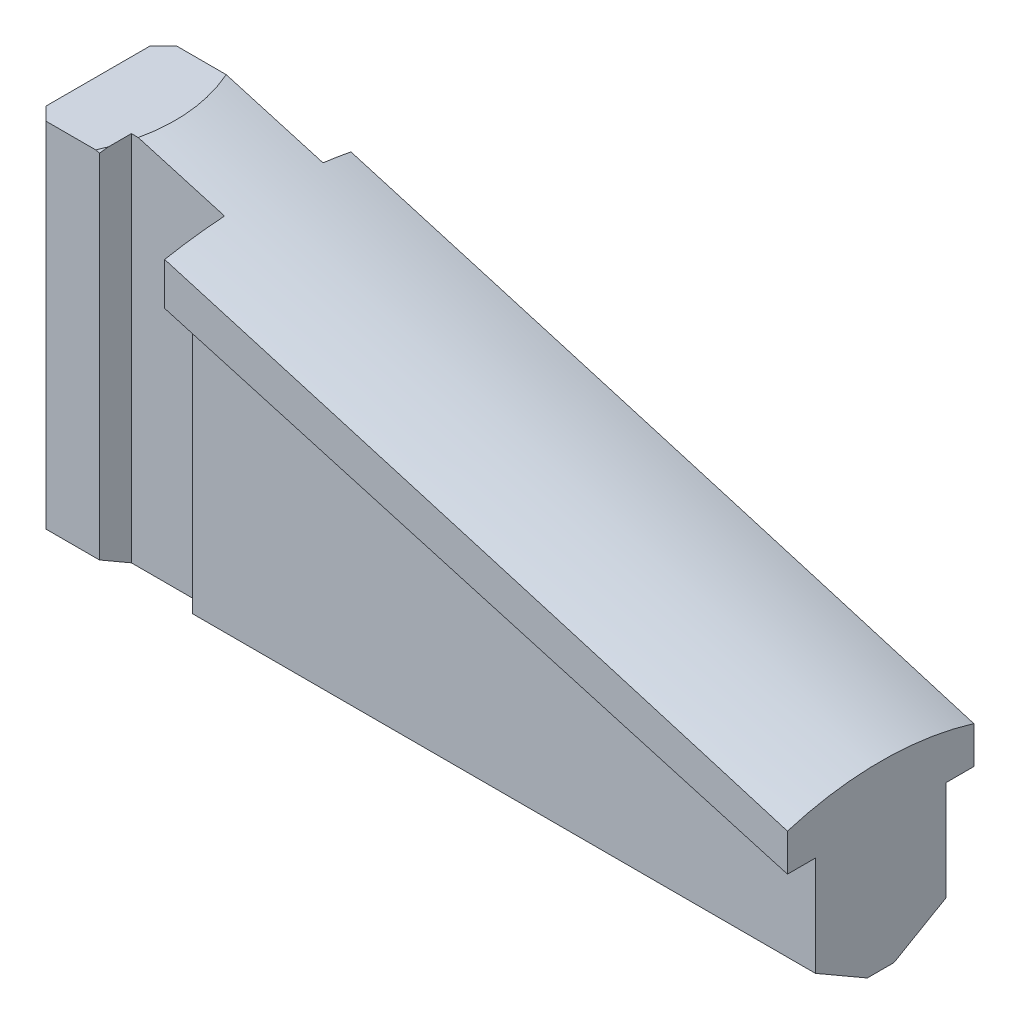
ISO-10303-21;
HEADER;
FILE_DESCRIPTION(('STEP AP214'),'2;1');
FILE_NAME('part.step','',(''),(''),'','','');
FILE_SCHEMA(('AUTOMOTIVE_DESIGN { 1 0 10303 214 1 1 1 1 }'));
ENDSEC;
DATA;
#1=APPLICATION_CONTEXT('core data for automotive mechanical design processes');
#2=APPLICATION_PROTOCOL_DEFINITION('international standard','automotive_design',2000,#1);
#3=PRODUCT_CONTEXT('',#1,'mechanical');
#4=PRODUCT('Part','Part','',(#3));
#5=PRODUCT_RELATED_PRODUCT_CATEGORY('part','',(#4));
#6=PRODUCT_DEFINITION_FORMATION('','',#4);
#7=PRODUCT_DEFINITION_CONTEXT('part definition',#1,'design');
#8=PRODUCT_DEFINITION('design','',#6,#7);
#9=PRODUCT_DEFINITION_SHAPE('','',#8);
#10=(LENGTH_UNIT() NAMED_UNIT(*) SI_UNIT(.MILLI.,.METRE.));
#11=(NAMED_UNIT(*) PLANE_ANGLE_UNIT() SI_UNIT($,.RADIAN.));
#12=(NAMED_UNIT(*) SI_UNIT($,.STERADIAN.) SOLID_ANGLE_UNIT());
#13=UNCERTAINTY_MEASURE_WITH_UNIT(LENGTH_MEASURE(1.E-05),#10,'distance_accuracy_value','');
#14=(GEOMETRIC_REPRESENTATION_CONTEXT(3) GLOBAL_UNCERTAINTY_ASSIGNED_CONTEXT((#13)) GLOBAL_UNIT_ASSIGNED_CONTEXT((#10,
#11,#12)) REPRESENTATION_CONTEXT('',''));
#15=CARTESIAN_POINT('',(0.,0.,0.));
#16=DIRECTION('',(0.,0.,1.));
#17=DIRECTION('',(1.,0.,0.));
#18=AXIS2_PLACEMENT_3D('',#15,#16,#17);
#19=CARTESIAN_POINT('',(29.4,0.,0.));
#20=DIRECTION('',(-1.,0.,0.));
#21=DIRECTION('',(0.,-1.,0.));
#22=AXIS2_PLACEMENT_3D('',#19,#20,#21);
#23=CONICAL_SURFACE('',#22,12.,0.279252680319085);
#24=CARTESIAN_POINT('',(16.648974308552,15.4634136010911,2.45));
#25=CARTESIAN_POINT('',(14.2499015648652,16.1598687928455,2.45));
#26=CARTESIAN_POINT('',(11.8505479962194,16.8553553952881,2.45));
#27=CARTESIAN_POINT('',(7.05141396770957,18.2448524503624,2.45));
#28=CARTESIAN_POINT('',(4.65163350793611,18.9388629033066,2.45));
#29=CARTESIAN_POINT('',(-0.148220273695114,20.3258688999498,2.45));
#30=CARTESIAN_POINT('',(-2.54829359551783,21.01886444377,2.45));
#31=CARTESIAN_POINT('',(-7.34866481559835,22.404079198679,2.45));
#32=CARTESIAN_POINT('',(-9.74896271390276,23.0962984096063,2.45));
#33=CARTESIAN_POINT('',(-12.1493381150406,23.7882485567215,2.45));
#34=B_SPLINE_CURVE_WITH_KNOTS('',3,(#24,#25,#26,#27,#28,#29,#30,#31,#32,#33),.UNSPECIFIED.,.F.,
.F.,(4,2,2,2,4),(0.,7.49435710344259,14.9887126194894,22.4830672397679,29.9774234187303),.UNSPECIFIED.);
#35=CARTESIAN_POINT('',(2.5,19.5606146497602,2.45));
#36=VERTEX_POINT('',#35);
#37=CARTESIAN_POINT('',(2.36370972869778,19.6,2.45));
#38=VERTEX_POINT('',#37);
#39=EDGE_CURVE('E210',#36,#38,#34,.T.);
#40=ORIENTED_EDGE('',*,*,#39,.F.);
#41=CARTESIAN_POINT('',(2.5,0.,0.));
#42=DIRECTION('',(-1.,0.,0.));
#43=DIRECTION('',(0.,0.,1.));
#44=AXIS2_PLACEMENT_3D('',#41,#42,#43);
#45=CIRCLE('',#44,19.7134508769117);
#46=CARTESIAN_POINT('',(2.5,19.6,2.11190565045207));
#47=VERTEX_POINT('',#46);
#48=EDGE_CURVE('E216',#47,#36,#45,.F.);
#49=ORIENTED_EDGE('',*,*,#48,.F.);
#50=CARTESIAN_POINT('',(-32.9761026612706,19.6,-22.5613953379317));
#51=CARTESIAN_POINT('',(-32.4037117276343,19.6,-22.3439756519684));
#52=CARTESIAN_POINT('',(-31.8317673076096,19.6,-22.1253815060157));
#53=CARTESIAN_POINT('',(-30.6888624996613,19.6,-21.6856253566966));
#54=CARTESIAN_POINT('',(-30.1179021180518,19.6,-21.4644633369235));
#55=CARTESIAN_POINT('',(-28.4065227980442,19.6,-20.7967537598207));
#56=CARTESIAN_POINT('',(-27.267727858128,19.6,-20.3460289834775));
#57=CARTESIAN_POINT('',(-24.9925625901961,19.6,-19.4300769273884));
#58=CARTESIAN_POINT('',(-23.856206099606,19.6,-18.9648152289642));
#59=CARTESIAN_POINT('',(-21.5903228813989,19.6,-18.0180243647236));
#60=CARTESIAN_POINT('',(-20.4607958457072,19.6,-17.536495939247));
#61=CARTESIAN_POINT('',(-18.5845528789361,19.6,-16.7166154177673));
#62=CARTESIAN_POINT('',(-17.8353865180602,19.6,-16.3838729753218));
#63=CARTESIAN_POINT('',(-16.3418196340869,19.6,-15.7077944962536));
#64=CARTESIAN_POINT('',(-15.5974192014677,19.6,-15.3644582592298));
#65=CARTESIAN_POINT('',(-14.1154293473856,19.6,-14.6656713370954));
#66=CARTESIAN_POINT('',(-13.3778326934464,19.6,-14.3102360231317));
#67=CARTESIAN_POINT('',(-11.9100760846921,19.6,-13.5843370766536));
#68=CARTESIAN_POINT('',(-11.1799157987687,19.6,-13.2138741169456));
#69=CARTESIAN_POINT('',(-9.96405354427752,19.6,-12.5774341037494));
#70=CARTESIAN_POINT('',(-9.47573549603862,19.6,-12.3164572331979));
#71=CARTESIAN_POINT('',(-8.50446829629357,19.6,-11.784709340877));
#72=CARTESIAN_POINT('',(-8.02151894903578,19.6,-11.5139386777467));
#73=CARTESIAN_POINT('',(-7.06105990283729,19.6,-10.9602326773217));
#74=CARTESIAN_POINT('',(-6.58356627281471,19.6,-10.6772693804072));
#75=CARTESIAN_POINT('',(-5.63699211912866,19.6,-10.0976439551953));
#76=CARTESIAN_POINT('',(-5.16791077276661,19.6,-9.80098317673032));
#77=CARTESIAN_POINT('',(-4.22811194939514,19.6,-9.18292901731352));
#78=CARTESIAN_POINT('',(-3.75768942942859,19.6,-8.86108516833704));
#79=CARTESIAN_POINT('',(-2.83185165618119,19.6,-8.19573914092854));
#80=CARTESIAN_POINT('',(-2.37644427001668,19.6,-7.85222587508762));
#81=CARTESIAN_POINT('',(-1.71022345967279,19.6,-7.31735433038008));
#82=CARTESIAN_POINT('',(-1.49129258024198,19.6,-7.13609414578184));
#83=CARTESIAN_POINT('',(-1.05991693228104,19.6,-6.76603246286251));
#84=CARTESIAN_POINT('',(-0.847471366392736,19.6,-6.57723189826044));
#85=CARTESIAN_POINT('',(-0.430638290164144,19.6,-6.19130300817174));
#86=CARTESIAN_POINT('',(-0.226243110019437,19.6,-5.99418299897473));
#87=CARTESIAN_POINT('',(0.172843030773745,19.6,-5.59039922037483));
#88=CARTESIAN_POINT('',(0.367536502151622,19.6,-5.38373794713165));
#89=CARTESIAN_POINT('',(0.707016040224538,19.6,-5.00218617018962));
#90=CARTESIAN_POINT('',(0.853977495164868,19.6,-4.82924129687953));
#91=CARTESIAN_POINT('',(1.13859146051837,19.6,-4.47587421580012));
#92=CARTESIAN_POINT('',(1.27624331967451,19.6,-4.29545148633497));
#93=CARTESIAN_POINT('',(1.67235329508835,19.6,-3.74218576449378));
#94=CARTESIAN_POINT('',(1.91428985179766,19.6,-3.35699211824213));
#95=CARTESIAN_POINT('',(2.29055811810728,19.6,-2.63287276558472));
#96=CARTESIAN_POINT('',(2.4367492115385,19.6,-2.30026569364202));
#97=CARTESIAN_POINT('',(2.61455883885051,19.6,-1.78746631092453));
#98=CARTESIAN_POINT('',(2.66688645021653,19.6,-1.6143856715285));
#99=CARTESIAN_POINT('',(2.75627609376926,19.6,-1.26436269774037));
#100=CARTESIAN_POINT('',(2.79334642470975,19.6,-1.08742251793142));
#101=CARTESIAN_POINT('',(2.84642972070667,19.6,-0.758941432175118));
#102=CARTESIAN_POINT('',(2.86483843375335,19.6,-0.607785450560269));
#103=CARTESIAN_POINT('',(2.88945206715889,19.6,-0.304424716506118));
#104=CARTESIAN_POINT('',(2.89565275919185,19.6,-0.152219619008924));
#105=CARTESIAN_POINT('',(2.89564715268429,19.6,0.184783225109387));
#106=CARTESIAN_POINT('',(2.88650291841559,19.6,0.369587849325975));
#107=CARTESIAN_POINT('',(2.85028896690921,19.6,0.737499610884878));
#108=CARTESIAN_POINT('',(2.82320966241454,19.6,0.920605787203419));
#109=CARTESIAN_POINT('',(2.75210849424193,19.6,1.28377592085298));
#110=CARTESIAN_POINT('',(2.70806031542061,19.6,1.46383469729142));
#111=CARTESIAN_POINT('',(2.60454257817562,19.6,1.81951176633121));
#112=CARTESIAN_POINT('',(2.54506249614258,19.6,1.99512693862231));
#113=CARTESIAN_POINT('',(2.30427165763243,19.6,2.62302316125304));
#114=CARTESIAN_POINT('',(2.08230946019525,19.6,3.06008853193767));
#115=CARTESIAN_POINT('',(1.70164415269635,19.6,3.68522964861305));
#116=CARTESIAN_POINT('',(1.56652788542073,19.6,3.88885824713228));
#117=CARTESIAN_POINT('',(1.2831364085347,19.6,4.28683377149784));
#118=CARTESIAN_POINT('',(1.13486264315188,19.6,4.48118171243876));
#119=CARTESIAN_POINT('',(0.790944913344987,19.6,4.90658096243323));
#120=CARTESIAN_POINT('',(0.592448334942414,19.6,5.13530465877458));
#121=CARTESIAN_POINT('',(0.182580718973677,19.6,5.58098944974586));
#122=CARTESIAN_POINT('',(-0.0287953526772932,19.6,5.79794588157711));
#123=CARTESIAN_POINT('',(-0.46203197667514,19.6,6.22172285893849));
#124=CARTESIAN_POINT('',(-0.683907576483541,19.6,6.42852793531985));
#125=CARTESIAN_POINT('',(-1.13588736347237,19.6,6.83295301781529));
#126=CARTESIAN_POINT('',(-1.3659924999303,19.6,7.03057195822244));
#127=CARTESIAN_POINT('',(-1.83581930597113,19.6,7.42012260034748));
#128=CARTESIAN_POINT('',(-2.07562523110806,19.6,7.61195232587221));
#129=CARTESIAN_POINT('',(-2.56091145127948,19.6,7.98828556745229));
#130=CARTESIAN_POINT('',(-2.80639190459472,19.6,8.17278887875942));
#131=CARTESIAN_POINT('',(-3.30182787792126,19.6,8.53510859401967));
#132=CARTESIAN_POINT('',(-3.55177836369394,19.6,8.71293189749269));
#133=CARTESIAN_POINT('',(-4.05567203684115,19.6,9.06279157826125));
#134=CARTESIAN_POINT('',(-4.30961508321022,19.6,9.23482815925611));
#135=CARTESIAN_POINT('',(-5.14242746108447,19.6,9.78688974963045));
#136=CARTESIAN_POINT('',(-5.72828854185113,19.6,10.1563880903412));
#137=CARTESIAN_POINT('',(-6.91261283662009,19.6,10.8746903397837));
#138=CARTESIAN_POINT('',(-7.51107882718987,19.6,11.2234896230133));
#139=CARTESIAN_POINT('',(-8.71794252239,19.6,11.9045180372574));
#140=CARTESIAN_POINT('',(-9.32634751575072,19.6,12.2367342097782));
#141=CARTESIAN_POINT('',(-10.5504707571136,19.6,12.8872301303857));
#142=CARTESIAN_POINT('',(-11.1661884181356,19.6,13.2055109875619));
#143=CARTESIAN_POINT('',(-12.4059357524608,19.6,13.8316463832656));
#144=CARTESIAN_POINT('',(-13.0299886266361,19.6,14.1394548649588));
#145=CARTESIAN_POINT('',(-14.2829174063942,19.6,14.7450991131054));
#146=CARTESIAN_POINT('',(-14.9117933963925,19.6,15.0429347045189));
#147=CARTESIAN_POINT('',(-16.1732535188856,19.6,15.6299077762231));
#148=CARTESIAN_POINT('',(-16.8058359269823,19.6,15.9190489686718));
#149=CARTESIAN_POINT('',(-18.0743496524969,19.6,16.4898967347759));
#150=CARTESIAN_POINT('',(-18.7102810117578,19.6,16.7716032152736));
#151=CARTESIAN_POINT('',(-20.4747796546366,19.6,17.5425217465608));
#152=CARTESIAN_POINT('',(-21.6063647535255,19.6,18.0248296707626));
#153=CARTESIAN_POINT('',(-23.8764625219945,19.6,18.9731755821111));
#154=CARTESIAN_POINT('',(-25.0149760106162,19.6,19.4392116000033));
#155=CARTESIAN_POINT('',(-27.2882890293088,19.6,20.3541938129891));
#156=CARTESIAN_POINT('',(-28.4230456604573,19.6,20.8032467310804));
#157=CARTESIAN_POINT('',(-30.1282995205691,19.6,21.4684964330804));
#158=CARTESIAN_POINT('',(-30.6971853889986,19.6,21.6888383848163));
#159=CARTESIAN_POINT('',(-31.8359339637115,19.6,22.1269739814008));
#160=CARTESIAN_POINT('',(-32.4057966642743,19.6,22.3447676411151));
#161=CARTESIAN_POINT('',(-32.9761026612707,19.6,22.5613953379317));
#162=B_SPLINE_CURVE_WITH_KNOTS('',3,(#50,#51,#52,#53,#54,#55,#56,#57,#58,#59,#60,#61,#62,#63,
#64,#65,#66,#67,#68,#69,#70,#71,#72,#73,#74,#75,#76,#77,#78,#79,#80,#81,#82,#83,#84,#85,#86,#87,
#88,#89,#90,#91,#92,#93,#94,#95,#96,#97,#98,#99,#100,#101,#102,#103,#104,#105,#106,#107,#108,
#109,#110,#111,#112,#113,#114,#115,#116,#117,#118,#119,#120,#121,#122,#123,#124,#125,#126,#127,
#128,#129,#130,#131,#132,#133,#134,#135,#136,#137,#138,#139,#140,#141,#142,#143,#144,#145,#146,
#147,#148,#149,#150,#151,#152,#153,#154,#155,#156,#157,#158,#159,#160,#161),.UNSPECIFIED.,.F.,
.F.,(4,2,2,2,2,2,2,2,2,2,2,2,2,2,2,2,2,2,2,2,2,2,2,2,2,2,2,2,2,2,2,2,2,2,2,2,2,2,2,2,2,2,2,2,2,
2,2,2,2,2,2,2,2,2,2,4),(0.,1.83687632474504,3.67376439219321,7.34793246840589,11.0315806296531,
14.7150613640671,17.1742050369041,19.6333952575021,22.0895699845274,24.5456348666396,
26.2065892486815,27.8674828696458,29.5324122072418,31.1971778214068,32.9066929583208,
34.6170899969298,35.4696388170458,36.3220823920952,37.1736931443152,38.0250823491319,
38.7056375622454,39.3862403347703,40.7460157080446,41.8317726896373,42.373644924596,
42.915222033163,43.3715706437659,43.8280772858324,44.3822421835907,44.9367035515556,
45.4920282561841,46.0477326580858,47.5084627821284,48.2413574120247,48.9741716953041,
49.8821073204126,50.7904001268682,51.7000366012292,52.6097783427863,53.5308925195205,
54.4520324201541,55.3721931753557,56.2923215058664,58.3696324043435,60.4474057732402,
62.5267781377556,64.6059847063747,66.6933891795409,68.78083027074,70.8673670753062,
72.9539300119745,76.6440026214591,80.3345202729014,83.9955785794344,85.8257747098621,
87.6559601584339),.UNSPECIFIED.);
#163=EDGE_CURVE('E194',#47,#38,#162,.T.);
#164=ORIENTED_EDGE('',*,*,#163,.T.);
#165=EDGE_LOOP('',(#40,#49,#164));
#166=FACE_BOUND('',#165,.T.);
#167=ADVANCED_FACE('F37',(#166),#23,.T.);
#168=CARTESIAN_POINT('',(-28.8555086557732,26.7827385853238,2.45));
#169=DIRECTION('',(0.,0.,-1.));
#170=DIRECTION('',(-1.,0.,0.));
#171=AXIS2_PLACEMENT_3D('',#168,#169,#170);
#172=PLANE('',#171);
#173=DIRECTION('',(-1.,0.,0.));
#174=VECTOR('',#173,1.);
#175=CARTESIAN_POINT('',(0.,19.6,2.45));
#176=LINE('',#175,#174);
#177=CARTESIAN_POINT('',(0.499999999999997,19.6,2.45));
#178=VERTEX_POINT('',#177);
#179=EDGE_CURVE('E195',#38,#178,#176,.T.);
#180=ORIENTED_EDGE('',*,*,#179,.T.);
#181=DIRECTION('',(0.,-1.,0.));
#182=VECTOR('',#181,1.);
#183=CARTESIAN_POINT('',(0.499999999999998,6.32583302491978,2.45));
#184=LINE('',#183,#182);
#185=CARTESIAN_POINT('',(0.499999999999998,6.32583302491978,2.45));
#186=VERTEX_POINT('',#185);
#187=EDGE_CURVE('E45',#178,#186,#184,.T.);
#188=ORIENTED_EDGE('',*,*,#187,.T.);
#189=DIRECTION('',(1.,0.,0.));
#190=VECTOR('',#189,1.);
#191=CARTESIAN_POINT('',(0.,6.32583302491978,2.45));
#192=LINE('',#191,#190);
#193=CARTESIAN_POINT('',(2.5,6.32583302491978,2.45));
#194=VERTEX_POINT('',#193);
#195=EDGE_CURVE('E381',#186,#194,#192,.T.);
#196=ORIENTED_EDGE('',*,*,#195,.T.);
#197=DIRECTION('',(0.,1.,0.));
#198=VECTOR('',#197,1.);
#199=CARTESIAN_POINT('',(2.5,5.2,2.45));
#200=LINE('',#199,#198);
#201=EDGE_CURVE('E187',#194,#36,#200,.T.);
#202=ORIENTED_EDGE('',*,*,#201,.T.);
#203=ORIENTED_EDGE('',*,*,#39,.T.);
#204=EDGE_LOOP('',(#180,#188,#196,#202,#203));
#205=FACE_BOUND('',#204,.T.);
#206=ADVANCED_FACE('F423',(#205),#172,.F.);
#207=CARTESIAN_POINT('',(0.,0.,-20.4303143413087));
#208=DIRECTION('',(-1.,0.,0.));
#209=DIRECTION('',(0.,-1.,0.));
#210=AXIS2_PLACEMENT_3D('',#207,#208,#209);
#211=PLANE('',#210);
#212=DIRECTION('',(0.,0.,1.));
#213=VECTOR('',#212,1.);
#214=CARTESIAN_POINT('',(0.,19.6,3.5));
#215=LINE('',#214,#213);
#216=CARTESIAN_POINT('',(0.,19.6,-1.95));
#217=VERTEX_POINT('',#216);
#218=CARTESIAN_POINT('',(0.,19.6,1.95));
#219=VERTEX_POINT('',#218);
#220=EDGE_CURVE('E256',#217,#219,#215,.T.);
#221=ORIENTED_EDGE('',*,*,#220,.F.);
#222=DIRECTION('',(0.,-1.,0.));
#223=VECTOR('',#222,1.);
#224=CARTESIAN_POINT('',(0.,6.32583302491978,-1.95));
#225=LINE('',#224,#223);
#226=CARTESIAN_POINT('',(0.,6.03715789032496,-1.95));
#227=VERTEX_POINT('',#226);
#228=EDGE_CURVE('E245',#217,#227,#225,.T.);
#229=ORIENTED_EDGE('',*,*,#228,.T.);
#230=DIRECTION('',(0.,0.500000000000001,-0.866025403784438));
#231=VECTOR('',#230,1.);
#232=CARTESIAN_POINT('',(0.,5.2,-0.500000000000001));
#233=LINE('',#232,#231);
#234=CARTESIAN_POINT('',(0.,5.2,-0.500000000000001));
#235=VERTEX_POINT('',#234);
#236=EDGE_CURVE('E268',#235,#227,#233,.T.);
#237=ORIENTED_EDGE('',*,*,#236,.F.);
#238=DIRECTION('',(0.,0.,-1.));
#239=VECTOR('',#238,1.);
#240=CARTESIAN_POINT('',(0.,5.2,0.499999999999999));
#241=LINE('',#240,#239);
#242=CARTESIAN_POINT('',(0.,5.2,0.499999999999999));
#243=VERTEX_POINT('',#242);
#244=EDGE_CURVE('E301',#243,#235,#241,.T.);
#245=ORIENTED_EDGE('',*,*,#244,.F.);
#246=DIRECTION('',(0.,-0.500000000000001,-0.866025403784438));
#247=VECTOR('',#246,1.);
#248=CARTESIAN_POINT('',(0.,6.93205080756888,3.5));
#249=LINE('',#248,#247);
#250=CARTESIAN_POINT('',(0.,6.03715789032496,1.95));
#251=VERTEX_POINT('',#250);
#252=EDGE_CURVE('E299',#251,#243,#249,.T.);
#253=ORIENTED_EDGE('',*,*,#252,.F.);
#254=DIRECTION('',(0.,1.,0.));
#255=VECTOR('',#254,1.);
#256=CARTESIAN_POINT('',(0.,19.6,1.95));
#257=LINE('',#256,#255);
#258=EDGE_CURVE('E240',#251,#219,#257,.T.);
#259=ORIENTED_EDGE('',*,*,#258,.T.);
#260=EDGE_LOOP('',(#221,#229,#237,#245,#253,#259));
#261=FACE_BOUND('',#260,.T.);
#262=ADVANCED_FACE('F262',(#261),#211,.T.);
#263=CARTESIAN_POINT('',(0.,19.6,3.5));
#264=DIRECTION('',(0.,0.,1.));
#265=DIRECTION('',(0.,-1.,0.));
#266=AXIS2_PLACEMENT_3D('',#263,#264,#265);
#267=PLANE('',#266);
#268=DIRECTION('',(0.,1.,0.));
#269=VECTOR('',#268,1.);
#270=CARTESIAN_POINT('',(6.,5.2,3.5));
#271=LINE('',#270,#269);
#272=CARTESIAN_POINT('',(6.,16.7880823100049,3.5));
#273=VERTEX_POINT('',#272);
#274=CARTESIAN_POINT('',(6.,18.3795589899802,3.5));
#275=VERTEX_POINT('',#274);
#276=EDGE_CURVE('E197',#273,#275,#271,.T.);
#277=ORIENTED_EDGE('',*,*,#276,.F.);
#278=DIRECTION('',(0.961261695938321,-0.275637355816993,0.));
#279=VECTOR('',#278,1.);
#280=CARTESIAN_POINT('',(-28.8555086557732,26.7827385853238,3.5));
#281=LINE('',#280,#279);
#282=CARTESIAN_POINT('',(29.4,10.078240283249,3.5));
#283=VERTEX_POINT('',#282);
#284=EDGE_CURVE('E366',#273,#283,#281,.T.);
#285=ORIENTED_EDGE('',*,*,#284,.T.);
#286=DIRECTION('',(0.,-1.,0.));
#287=VECTOR('',#286,1.);
#288=CARTESIAN_POINT('',(29.4,19.6,3.5));
#289=LINE('',#288,#287);
#290=CARTESIAN_POINT('',(29.4,11.478240283249,3.5));
#291=VERTEX_POINT('',#290);
#292=EDGE_CURVE('E281',#291,#283,#289,.T.);
#293=ORIENTED_EDGE('',*,*,#292,.F.);
#294=CARTESIAN_POINT('',(-24.4862239665545,27.2275921511048,3.5));
#295=CARTESIAN_POINT('',(-22.0798199408507,26.5318728919526,3.5));
#296=CARTESIAN_POINT('',(-19.6735231528163,25.8357822455356,3.5));
#297=CARTESIAN_POINT('',(-14.8612253958074,24.4425777870014,3.5));
#298=CARTESIAN_POINT('',(-12.4552244268803,23.7454639747201,3.5));
#299=CARTESIAN_POINT('',(-7.643401781421,22.3498754033885,3.5));
#300=CARTESIAN_POINT('',(-5.23758013609523,21.6514005367203,3.5));
#301=CARTESIAN_POINT('',(-0.426441208162646,20.2527148818305,3.5));
#302=CARTESIAN_POINT('',(1.97887607441682,19.5525040935148,3.5));
#303=CARTESIAN_POINT('',(6.78880785262404,18.1497081197026,3.5));
#304=CARTESIAN_POINT('',(9.19342235103349,17.4471229437465,3.5));
#305=CARTESIAN_POINT('',(14.0016667244368,16.0385888610674,3.5));
#306=CARTESIAN_POINT('',(16.4052965995313,15.3326399546887,3.5));
#307=CARTESIAN_POINT('',(20.0095530676765,14.2699397550698,3.5));
#308=CARTESIAN_POINT('',(21.2107393959649,13.9150871143786,3.5));
#309=CARTESIAN_POINT('',(23.6126381065094,13.2037818208288,3.5));
#310=CARTESIAN_POINT('',(24.8133504888813,12.8473291683611,3.5));
#311=CARTESIAN_POINT('',(27.2141727876265,12.1323854452225,3.5));
#312=CARTESIAN_POINT('',(28.4142827020149,11.773894367883,3.5));
#313=CARTESIAN_POINT('',(30.8137050134346,11.0542534530831,3.5));
#314=CARTESIAN_POINT('',(32.0130174109581,10.6931036172653,3.5));
#315=CARTESIAN_POINT('',(34.4106417489478,9.96720747548132,3.5));
#316=CARTESIAN_POINT('',(35.6089536170361,9.60246093028408,3.5));
#317=CARTESIAN_POINT('',(38.0040498344003,8.8680255437063,3.5));
#318=CARTESIAN_POINT('',(39.2008342022994,8.49833676322404,3.5));
#319=CARTESIAN_POINT('',(40.9943554707307,7.93835433823676,3.5));
#320=CARTESIAN_POINT('',(41.591940726117,7.75077871562689,3.5));
#321=CARTESIAN_POINT('',(42.786396076621,7.37337046382224,3.5));
#322=CARTESIAN_POINT('',(43.3832661745867,7.18353784364913,3.5));
#323=CARTESIAN_POINT('',(44.5761235718612,6.80103571845603,3.5));
#324=CARTESIAN_POINT('',(45.1721108365771,6.60836610534729,3.5));
#325=CARTESIAN_POINT('',(46.06520273882,6.31662652843912,3.5));
#326=CARTESIAN_POINT('',(46.3627539074134,6.21892346513811,3.5));
#327=CARTESIAN_POINT('',(46.9575092499282,6.02246387545338,3.5));
#328=CARTESIAN_POINT('',(47.2547134227113,5.92370734562506,3.5));
#329=CARTESIAN_POINT('',(47.5517184759023,5.82435331999529,3.5));
#330=B_SPLINE_CURVE_WITH_KNOTS('',3,(#294,#295,#296,#297,#298,#299,#300,#301,#302,#303,#304,
#305,#306,#307,#308,#309,#310,#311,#312,#313,#314,#315,#316,#317,#318,#319,#320,#321,#322,#323,
#324,#325,#326,#327,#328,#329),.UNSPECIFIED.,.F.,.F.,(4,2,2,2,2,2,2,2,2,2,2,2,2,2,2,2,2,4),(0.,
7.51486880153095,15.0297388086319,22.5452293017897,30.0607202023464,37.5761809413504,
45.0916409115,48.8491553465311,52.6066688636819,56.3641946802612,60.1217181757054,
63.8794933075354,67.6372221786194,69.5162170565786,71.3952044263431,73.2742635712691,
74.2138060058775,75.1533515135305),.UNSPECIFIED.);
#331=EDGE_CURVE('E343',#275,#291,#330,.T.);
#332=ORIENTED_EDGE('',*,*,#331,.F.);
#333=EDGE_LOOP('',(#277,#285,#293,#332));
#334=FACE_BOUND('',#333,.T.);
#335=ADVANCED_FACE('F339',(#334),#267,.T.);
#336=CARTESIAN_POINT('',(0.,19.6,3.5));
#337=DIRECTION('',(0.,1.,0.));
#338=DIRECTION('',(-1.,0.,0.));
#339=AXIS2_PLACEMENT_3D('',#336,#337,#338);
#340=PLANE('',#339);
#341=DIRECTION('',(1.,0.,0.));
#342=VECTOR('',#341,1.);
#343=CARTESIAN_POINT('',(0.,19.6,-2.45));
#344=LINE('',#343,#342);
#345=CARTESIAN_POINT('',(0.499999999999998,19.6,-2.45));
#346=VERTEX_POINT('',#345);
#347=CARTESIAN_POINT('',(2.36370972869777,19.6,-2.45));
#348=VERTEX_POINT('',#347);
#349=EDGE_CURVE('E257',#346,#348,#344,.T.);
#350=ORIENTED_EDGE('',*,*,#349,.F.);
#351=DIRECTION('',(-0.70710678118655,0.,0.707106781186545));
#352=VECTOR('',#351,1.);
#353=CARTESIAN_POINT('',(-2.72500000000001,19.6,0.77499999999998));
#354=LINE('',#353,#352);
#355=EDGE_CURVE('E253',#346,#217,#354,.T.);
#356=ORIENTED_EDGE('',*,*,#355,.T.);
#357=ORIENTED_EDGE('',*,*,#220,.T.);
#358=DIRECTION('',(0.70710678118655,0.,0.707106781186545));
#359=VECTOR('',#358,1.);
#360=CARTESIAN_POINT('',(0.774999999999995,19.6,2.725));
#361=LINE('',#360,#359);
#362=EDGE_CURVE('E59',#219,#178,#361,.T.);
#363=ORIENTED_EDGE('',*,*,#362,.T.);
#364=ORIENTED_EDGE('',*,*,#179,.F.);
#365=ORIENTED_EDGE('',*,*,#163,.F.);
#366=DIRECTION('',(0.,0.,1.));
#367=VECTOR('',#366,1.);
#368=CARTESIAN_POINT('',(2.5,19.6,2.45));
#369=LINE('',#368,#367);
#370=CARTESIAN_POINT('',(2.5,19.6,1.25));
#371=VERTEX_POINT('',#370);
#372=EDGE_CURVE('E178',#371,#47,#369,.T.);
#373=ORIENTED_EDGE('',*,*,#372,.F.);
#374=DIRECTION('',(-1.,0.,0.));
#375=VECTOR('',#374,1.);
#376=CARTESIAN_POINT('',(2.5,19.6,1.25));
#377=LINE('',#376,#375);
#378=CARTESIAN_POINT('',(2.75678401454587,19.6,1.25));
#379=VERTEX_POINT('',#378);
#380=EDGE_CURVE('E167',#379,#371,#377,.T.);
#381=ORIENTED_EDGE('',*,*,#380,.F.);
#382=EDGE_CURVE('E316',#348,#379,#162,.T.);
#383=ORIENTED_EDGE('',*,*,#382,.F.);
#384=EDGE_LOOP('',(#350,#356,#357,#363,#364,#365,#373,#381,#383));
#385=FACE_BOUND('',#384,.T.);
#386=ADVANCED_FACE('F192',(#385),#340,.T.);
#387=CARTESIAN_POINT('',(0.,19.6,-3.5));
#388=DIRECTION('',(0.,0.,-1.));
#389=DIRECTION('',(0.,1.,0.));
#390=AXIS2_PLACEMENT_3D('',#387,#388,#389);
#391=PLANE('',#390);
#392=DIRECTION('',(0.,1.,0.));
#393=VECTOR('',#392,1.);
#394=CARTESIAN_POINT('',(6.,5.2,-3.5));
#395=LINE('',#394,#393);
#396=CARTESIAN_POINT('',(6.,16.7880823100049,-3.5));
#397=VERTEX_POINT('',#396);
#398=CARTESIAN_POINT('',(6.,18.3795589899802,-3.5));
#399=VERTEX_POINT('',#398);
#400=EDGE_CURVE('E393',#397,#399,#395,.T.);
#401=ORIENTED_EDGE('',*,*,#400,.T.);
#402=CARTESIAN_POINT('',(-24.4862239665545,27.2275921511048,-3.5));
#403=CARTESIAN_POINT('',(-22.0798199408507,26.5318728919526,-3.5));
#404=CARTESIAN_POINT('',(-19.6735231528163,25.8357822455356,-3.5));
#405=CARTESIAN_POINT('',(-14.8612253958074,24.4425777870014,-3.5));
#406=CARTESIAN_POINT('',(-12.4552244268803,23.7454639747201,-3.5));
#407=CARTESIAN_POINT('',(-7.643401781421,22.3498754033885,-3.5));
#408=CARTESIAN_POINT('',(-5.23758013609523,21.6514005367203,-3.5));
#409=CARTESIAN_POINT('',(-0.426441208162646,20.2527148818305,-3.5));
#410=CARTESIAN_POINT('',(1.97887607441682,19.5525040935148,-3.5));
#411=CARTESIAN_POINT('',(6.78880785262404,18.1497081197026,-3.5));
#412=CARTESIAN_POINT('',(9.19342235103349,17.4471229437465,-3.5));
#413=CARTESIAN_POINT('',(14.0016667244368,16.0385888610674,-3.5));
#414=CARTESIAN_POINT('',(16.4052965995313,15.3326399546887,-3.5));
#415=CARTESIAN_POINT('',(20.0095530676765,14.2699397550698,-3.5));
#416=CARTESIAN_POINT('',(21.2107393959649,13.9150871143786,-3.5));
#417=CARTESIAN_POINT('',(23.6126381065094,13.2037818208288,-3.5));
#418=CARTESIAN_POINT('',(24.8133504888813,12.8473291683611,-3.5));
#419=CARTESIAN_POINT('',(27.2141727876265,12.1323854452225,-3.5));
#420=CARTESIAN_POINT('',(28.4142827020149,11.773894367883,-3.5));
#421=CARTESIAN_POINT('',(30.8137050134346,11.0542534530831,-3.5));
#422=CARTESIAN_POINT('',(32.0130174109581,10.6931036172653,-3.5));
#423=CARTESIAN_POINT('',(34.4106417489478,9.96720747548132,-3.5));
#424=CARTESIAN_POINT('',(35.6089536170361,9.60246093028408,-3.5));
#425=CARTESIAN_POINT('',(38.0040498344003,8.8680255437063,-3.5));
#426=CARTESIAN_POINT('',(39.2008342022994,8.49833676322404,-3.5));
#427=CARTESIAN_POINT('',(40.9943554707307,7.93835433823676,-3.5));
#428=CARTESIAN_POINT('',(41.5919407261171,7.75077871562689,-3.5));
#429=CARTESIAN_POINT('',(42.786396076621,7.37337046382224,-3.5));
#430=CARTESIAN_POINT('',(43.3832661745867,7.18353784364913,-3.5));
#431=CARTESIAN_POINT('',(44.5761235718612,6.80103571845603,-3.5));
#432=CARTESIAN_POINT('',(45.1721108365771,6.60836610534729,-3.5));
#433=CARTESIAN_POINT('',(46.06520273882,6.31662652843912,-3.5));
#434=CARTESIAN_POINT('',(46.3627539074134,6.21892346513811,-3.5));
#435=CARTESIAN_POINT('',(46.9575092499282,6.02246387545338,-3.5));
#436=CARTESIAN_POINT('',(47.2547134227113,5.92370734562506,-3.5));
#437=CARTESIAN_POINT('',(47.5517184759023,5.82435331999529,-3.5));
#438=B_SPLINE_CURVE_WITH_KNOTS('',3,(#402,#403,#404,#405,#406,#407,#408,#409,#410,#411,#412,
#413,#414,#415,#416,#417,#418,#419,#420,#421,#422,#423,#424,#425,#426,#427,#428,#429,#430,#431,
#432,#433,#434,#435,#436,#437),.UNSPECIFIED.,.F.,.F.,(4,2,2,2,2,2,2,2,2,2,2,2,2,2,2,2,2,4),(0.,
7.51486880153095,15.0297388086319,22.5452293017897,30.0607202023464,37.5761809413504,
45.0916409115,48.8491553465311,52.6066688636819,56.3641946802612,60.1217181757054,
63.8794933075354,67.6372221786194,69.5162170565786,71.3952044263431,73.2742635712691,
74.2138060058775,75.1533515135305),.UNSPECIFIED.);
#439=CARTESIAN_POINT('',(29.4,11.478240283249,-3.5));
#440=VERTEX_POINT('',#439);
#441=EDGE_CURVE('E307',#440,#399,#438,.F.);
#442=ORIENTED_EDGE('',*,*,#441,.F.);
#443=DIRECTION('',(0.,1.,0.));
#444=VECTOR('',#443,1.);
#445=CARTESIAN_POINT('',(29.4,19.6,-3.5));
#446=LINE('',#445,#444);
#447=CARTESIAN_POINT('',(29.4,10.078240283249,-3.5));
#448=VERTEX_POINT('',#447);
#449=EDGE_CURVE('E297',#448,#440,#446,.T.);
#450=ORIENTED_EDGE('',*,*,#449,.F.);
#451=DIRECTION('',(0.961261695938321,-0.275637355816993,0.));
#452=VECTOR('',#451,1.);
#453=CARTESIAN_POINT('',(-28.8555086557732,26.7827385853238,-3.5));
#454=LINE('',#453,#452);
#455=EDGE_CURVE('E287',#397,#448,#454,.T.);
#456=ORIENTED_EDGE('',*,*,#455,.F.);
#457=EDGE_LOOP('',(#401,#442,#450,#456));
#458=FACE_BOUND('',#457,.T.);
#459=ADVANCED_FACE('F322',(#458),#391,.T.);
#460=CARTESIAN_POINT('',(0.,5.2,-0.500000000000001));
#461=DIRECTION('',(0.,-0.866025403784438,-0.500000000000001));
#462=DIRECTION('',(0.,0.500000000000001,-0.866025403784438));
#463=AXIS2_PLACEMENT_3D('',#460,#461,#462);
#464=PLANE('',#463);
#465=ORIENTED_EDGE('',*,*,#236,.T.);
#466=DIRECTION('',(0.654653670707979,0.377964473009227,-0.654653670707975));
#467=VECTOR('',#466,1.);
#468=CARTESIAN_POINT('',(-0.828571428571435,5.55878195299642,-1.12142857142858));
#469=LINE('',#468,#467);
#470=CARTESIAN_POINT('',(0.499999999999998,6.32583302491978,-2.45));
#471=VERTEX_POINT('',#470);
#472=EDGE_CURVE('E248',#227,#471,#469,.T.);
#473=ORIENTED_EDGE('',*,*,#472,.T.);
#474=DIRECTION('',(-1.,0.,0.));
#475=VECTOR('',#474,1.);
#476=CARTESIAN_POINT('',(0.,6.32583302491978,-2.45));
#477=LINE('',#476,#475);
#478=CARTESIAN_POINT('',(29.4,6.32583302491978,-2.45));
#479=VERTEX_POINT('',#478);
#480=EDGE_CURVE('E275',#479,#471,#477,.T.);
#481=ORIENTED_EDGE('',*,*,#480,.F.);
#482=DIRECTION('',(0.,0.500000000000001,-0.866025403784438));
#483=VECTOR('',#482,1.);
#484=CARTESIAN_POINT('',(29.4,5.2,-0.500000000000001));
#485=LINE('',#484,#483);
#486=CARTESIAN_POINT('',(29.4,5.2,-0.500000000000001));
#487=VERTEX_POINT('',#486);
#488=EDGE_CURVE('E295',#487,#479,#485,.T.);
#489=ORIENTED_EDGE('',*,*,#488,.F.);
#490=DIRECTION('',(1.,0.,0.));
#491=VECTOR('',#490,1.);
#492=CARTESIAN_POINT('',(0.,5.2,-0.500000000000001));
#493=LINE('',#492,#491);
#494=EDGE_CURVE('E305',#235,#487,#493,.T.);
#495=ORIENTED_EDGE('',*,*,#494,.F.);
#496=EDGE_LOOP('',(#465,#473,#481,#489,#495));
#497=FACE_BOUND('',#496,.T.);
#498=ADVANCED_FACE('F273',(#497),#464,.T.);
#499=CARTESIAN_POINT('',(0.,5.2,0.499999999999999));
#500=DIRECTION('',(0.,-1.,0.));
#501=DIRECTION('',(1.,0.,0.));
#502=AXIS2_PLACEMENT_3D('',#499,#500,#501);
#503=PLANE('',#502);
#504=DIRECTION('',(0.,0.,-1.));
#505=VECTOR('',#504,1.);
#506=CARTESIAN_POINT('',(29.4,5.2,0.499999999999999));
#507=LINE('',#506,#505);
#508=CARTESIAN_POINT('',(29.4,5.2,0.499999999999999));
#509=VERTEX_POINT('',#508);
#510=EDGE_CURVE('E292',#509,#487,#507,.T.);
#511=ORIENTED_EDGE('',*,*,#510,.F.);
#512=DIRECTION('',(1.,0.,0.));
#513=VECTOR('',#512,1.);
#514=CARTESIAN_POINT('',(0.,5.2,0.499999999999999));
#515=LINE('',#514,#513);
#516=EDGE_CURVE('E267',#243,#509,#515,.T.);
#517=ORIENTED_EDGE('',*,*,#516,.F.);
#518=ORIENTED_EDGE('',*,*,#244,.T.);
#519=ORIENTED_EDGE('',*,*,#494,.T.);
#520=EDGE_LOOP('',(#511,#517,#518,#519));
#521=FACE_BOUND('',#520,.T.);
#522=ADVANCED_FACE('F331',(#521),#503,.T.);
#523=CARTESIAN_POINT('',(0.,6.93205080756888,3.5));
#524=DIRECTION('',(0.,-0.866025403784438,0.500000000000001));
#525=DIRECTION('',(0.,-0.500000000000001,-0.866025403784438));
#526=AXIS2_PLACEMENT_3D('',#523,#524,#525);
#527=PLANE('',#526);
#528=ORIENTED_EDGE('',*,*,#195,.F.);
#529=DIRECTION('',(-0.65465367070798,-0.377964473009227,-0.654653670707975));
#530=VECTOR('',#529,1.);
#531=CARTESIAN_POINT('',(0.885714285714282,6.5485252716072,2.83571428571428));
#532=LINE('',#531,#530);
#533=EDGE_CURVE('E12',#186,#251,#532,.T.);
#534=ORIENTED_EDGE('',*,*,#533,.T.);
#535=ORIENTED_EDGE('',*,*,#252,.T.);
#536=ORIENTED_EDGE('',*,*,#516,.T.);
#537=DIRECTION('',(0.,-0.500000000000001,-0.866025403784438));
#538=VECTOR('',#537,1.);
#539=CARTESIAN_POINT('',(29.4,6.93205080756889,3.5));
#540=LINE('',#539,#538);
#541=CARTESIAN_POINT('',(29.4,6.32583302491978,2.45));
#542=VERTEX_POINT('',#541);
#543=EDGE_CURVE('E285',#542,#509,#540,.T.);
#544=ORIENTED_EDGE('',*,*,#543,.F.);
#545=CARTESIAN_POINT('',(6.,6.32583302491978,2.45));
#546=VERTEX_POINT('',#545);
#547=EDGE_CURVE('E376',#546,#542,#192,.T.);
#548=ORIENTED_EDGE('',*,*,#547,.F.);
#549=DIRECTION('',(0.,0.500000000000001,0.866025403784438));
#550=VECTOR('',#549,1.);
#551=CARTESIAN_POINT('',(6.,6.93205080756888,3.5));
#552=LINE('',#551,#550);
#553=CARTESIAN_POINT('',(6.,5.63301270189222,1.25));
#554=VERTEX_POINT('',#553);
#555=EDGE_CURVE('E206',#554,#546,#552,.T.);
#556=ORIENTED_EDGE('',*,*,#555,.F.);
#557=DIRECTION('',(1.,0.,0.));
#558=VECTOR('',#557,1.);
#559=CARTESIAN_POINT('',(0.,5.63301270189222,1.25));
#560=LINE('',#559,#558);
#561=CARTESIAN_POINT('',(2.5,5.63301270189222,1.25));
#562=VERTEX_POINT('',#561);
#563=EDGE_CURVE('E404',#562,#554,#560,.T.);
#564=ORIENTED_EDGE('',*,*,#563,.F.);
#565=DIRECTION('',(0.,-0.500000000000001,-0.866025403784438));
#566=VECTOR('',#565,1.);
#567=CARTESIAN_POINT('',(2.5,6.93205080756888,3.5));
#568=LINE('',#567,#566);
#569=EDGE_CURVE('E186',#194,#562,#568,.T.);
#570=ORIENTED_EDGE('',*,*,#569,.F.);
#571=EDGE_LOOP('',(#528,#534,#535,#536,#544,#548,#556,#564,#570));
#572=FACE_BOUND('',#571,.T.);
#573=ADVANCED_FACE('F334',(#572),#527,.T.);
#574=CARTESIAN_POINT('',(29.4,0.,-12.));
#575=DIRECTION('',(1.,0.,0.));
#576=DIRECTION('',(0.,1.,0.));
#577=AXIS2_PLACEMENT_3D('',#574,#575,#576);
#578=PLANE('',#577);
#579=DIRECTION('',(0.,1.,0.));
#580=VECTOR('',#579,1.);
#581=CARTESIAN_POINT('',(29.4,0.,2.45));
#582=LINE('',#581,#580);
#583=CARTESIAN_POINT('',(29.4,10.078240283249,2.45));
#584=VERTEX_POINT('',#583);
#585=EDGE_CURVE('E351',#542,#584,#582,.T.);
#586=ORIENTED_EDGE('',*,*,#585,.F.);
#587=ORIENTED_EDGE('',*,*,#543,.T.);
#588=ORIENTED_EDGE('',*,*,#510,.T.);
#589=ORIENTED_EDGE('',*,*,#488,.T.);
#590=DIRECTION('',(0.,-1.,0.));
#591=VECTOR('',#590,1.);
#592=CARTESIAN_POINT('',(29.4,10.078240283249,-2.45));
#593=LINE('',#592,#591);
#594=CARTESIAN_POINT('',(29.4,10.078240283249,-2.45));
#595=VERTEX_POINT('',#594);
#596=EDGE_CURVE('E280',#595,#479,#593,.T.);
#597=ORIENTED_EDGE('',*,*,#596,.F.);
#598=DIRECTION('',(0.,0.,1.));
#599=VECTOR('',#598,1.);
#600=CARTESIAN_POINT('',(29.4,10.078240283249,-3.5));
#601=LINE('',#600,#599);
#602=EDGE_CURVE('E383',#448,#595,#601,.T.);
#603=ORIENTED_EDGE('',*,*,#602,.F.);
#604=ORIENTED_EDGE('',*,*,#449,.T.);
#605=CARTESIAN_POINT('',(29.4,0.,0.));
#606=DIRECTION('',(1.,0.,0.));
#607=DIRECTION('',(0.,1.,0.));
#608=AXIS2_PLACEMENT_3D('',#605,#606,#607);
#609=CIRCLE('',#608,12.);
#610=EDGE_CURVE('E348',#440,#291,#609,.T.);
#611=ORIENTED_EDGE('',*,*,#610,.T.);
#612=ORIENTED_EDGE('',*,*,#292,.T.);
#613=DIRECTION('',(0.,0.,1.));
#614=VECTOR('',#613,1.);
#615=CARTESIAN_POINT('',(29.4,10.078240283249,3.5));
#616=LINE('',#615,#614);
#617=EDGE_CURVE('E374',#584,#283,#616,.T.);
#618=ORIENTED_EDGE('',*,*,#617,.F.);
#619=EDGE_LOOP('',(#586,#587,#588,#589,#597,#603,#604,#611,#612,#618));
#620=FACE_BOUND('',#619,.T.);
#621=ADVANCED_FACE('F39',(#620),#578,.T.);
#622=CARTESIAN_POINT('',(20.6183732363522,14.4641786820629,1.25));
#623=CARTESIAN_POINT('',(17.7817321712238,15.2805742764108,1.25));
#624=CARTESIAN_POINT('',(14.9449718753429,16.096555380733,1.25));
#625=CARTESIAN_POINT('',(9.271277408197,17.7279126515956,1.25));
#626=CARTESIAN_POINT('',(6.43434323693603,18.5432888181501,1.25));
#627=CARTESIAN_POINT('',(0.760365517378261,20.1736602810059,1.25));
#628=CARTESIAN_POINT('',(-2.07667803091687,20.9886555773132,1.25));
#629=CARTESIAN_POINT('',(-7.75084561518896,22.6183661814938,1.25));
#630=CARTESIAN_POINT('',(-10.5879696511677,23.4330814893609,1.25));
#631=CARTESIAN_POINT('',(-13.4251194010924,24.2477072194325,1.25));
#632=B_SPLINE_CURVE_WITH_KNOTS('',3,(#622,#623,#624,#625,#626,#627,#628,#629,#630,#631),
.UNSPECIFIED.,.F.,.F.,(4,2,2,2,4),(0.,8.85535468880603,17.7107091729404,26.5660635217355,
35.4214180688607),.UNSPECIFIED.);
#633=CARTESIAN_POINT('',(6.,18.668039229286,1.25));
#634=VERTEX_POINT('',#633);
#635=EDGE_CURVE('E174',#634,#379,#632,.T.);
#636=ORIENTED_EDGE('',*,*,#635,.F.);
#637=CARTESIAN_POINT('',(6.,0.,0.));
#638=DIRECTION('',(1.,0.,0.));
#639=DIRECTION('',(0.,1.,0.));
#640=AXIS2_PLACEMENT_3D('',#637,#638,#639);
#641=CIRCLE('',#640,18.7098420267559);
#642=EDGE_CURVE('E208',#275,#634,#641,.F.);
#643=ORIENTED_EDGE('',*,*,#642,.F.);
#644=ORIENTED_EDGE('',*,*,#331,.T.);
#645=ORIENTED_EDGE('',*,*,#610,.F.);
#646=ORIENTED_EDGE('',*,*,#441,.T.);
#647=CARTESIAN_POINT('',(6.,0.,0.));
#648=DIRECTION('',(1.,0.,0.));
#649=DIRECTION('',(0.,1.,0.));
#650=AXIS2_PLACEMENT_3D('',#647,#648,#649);
#651=CIRCLE('',#650,18.7098420267559);
#652=CARTESIAN_POINT('',(6.,18.548738196065,-2.45));
#653=VERTEX_POINT('',#652);
#654=EDGE_CURVE('E378',#653,#399,#651,.F.);
#655=ORIENTED_EDGE('',*,*,#654,.F.);
#656=CARTESIAN_POINT('',(-14.8313585028478,24.561245884143,-2.45));
#657=CARTESIAN_POINT('',(-11.8917113345279,23.7140993247531,-2.45));
#658=CARTESIAN_POINT('',(-8.95216227176728,22.866611821312,-2.45));
#659=CARTESIAN_POINT('',(-3.07338868936273,21.1705158463323,-2.45));
#660=CARTESIAN_POINT('',(-0.13416416960698,20.3219073751813,-2.45));
#661=CARTESIAN_POINT('',(5.74383474337555,18.6231295927664,-2.45));
#662=CARTESIAN_POINT('',(8.68260913649237,17.7729602811217,-2.45));
#663=CARTESIAN_POINT('',(13.090250854916,16.4959099082395,-2.45));
#664=CARTESIAN_POINT('',(14.5593783685552,16.0699269762682,-2.45));
#665=CARTESIAN_POINT('',(17.497408593882,15.2171861059655,-2.45));
#666=CARTESIAN_POINT('',(18.9663113055478,14.7904281675589,-2.45));
#667=CARTESIAN_POINT('',(20.4350758022215,14.363194640758,-2.45));
#668=B_SPLINE_CURVE_WITH_KNOTS('',3,(#656,#657,#658,#659,#660,#661,#662,#663,#664,#665,#666,
#667),.UNSPECIFIED.,.F.,.F.,(4,2,2,2,2,4),(0.,9.17783461563956,18.3556660599056,
27.5334997426915,32.1224181630562,36.7113370286719),.UNSPECIFIED.);
#669=EDGE_CURVE('E401',#348,#653,#668,.T.);
#670=ORIENTED_EDGE('',*,*,#669,.F.);
#671=ORIENTED_EDGE('',*,*,#382,.T.);
#672=EDGE_LOOP('',(#636,#643,#644,#645,#646,#655,#670,#671));
#673=FACE_BOUND('',#672,.T.);
#674=ADVANCED_FACE('F218',(#673),#23,.T.);
#675=CARTESIAN_POINT('',(-28.8555086557732,26.7827385853238,-2.45));
#676=DIRECTION('',(0.,0.,1.));
#677=DIRECTION('',(1.,0.,0.));
#678=AXIS2_PLACEMENT_3D('',#675,#676,#677);
#679=PLANE('',#678);
#680=ORIENTED_EDGE('',*,*,#480,.T.);
#681=DIRECTION('',(0.,1.,0.));
#682=VECTOR('',#681,1.);
#683=CARTESIAN_POINT('',(0.499999999999997,19.6,-2.45));
#684=LINE('',#683,#682);
#685=EDGE_CURVE('E250',#471,#346,#684,.T.);
#686=ORIENTED_EDGE('',*,*,#685,.T.);
#687=ORIENTED_EDGE('',*,*,#349,.T.);
#688=ORIENTED_EDGE('',*,*,#669,.T.);
#689=DIRECTION('',(0.,1.,0.));
#690=VECTOR('',#689,1.);
#691=CARTESIAN_POINT('',(6.,5.2,-2.45));
#692=LINE('',#691,#690);
#693=CARTESIAN_POINT('',(5.99999999999999,16.7880823100049,-2.45));
#694=VERTEX_POINT('',#693);
#695=EDGE_CURVE('E408',#694,#653,#692,.T.);
#696=ORIENTED_EDGE('',*,*,#695,.F.);
#697=DIRECTION('',(0.961261695938321,-0.275637355816993,0.));
#698=VECTOR('',#697,1.);
#699=CARTESIAN_POINT('',(-28.8555086557732,26.7827385853238,-2.45));
#700=LINE('',#699,#698);
#701=EDGE_CURVE('E282',#694,#595,#700,.T.);
#702=ORIENTED_EDGE('',*,*,#701,.T.);
#703=ORIENTED_EDGE('',*,*,#596,.T.);
#704=EDGE_LOOP('',(#680,#686,#687,#688,#696,#702,#703));
#705=FACE_BOUND('',#704,.T.);
#706=ADVANCED_FACE('F278',(#705),#679,.F.);
#707=CARTESIAN_POINT('',(-28.8555086557732,26.7827385853238,-3.5));
#708=DIRECTION('',(0.275637355816993,0.961261695938321,0.));
#709=DIRECTION('',(-0.961261695938321,0.275637355816993,0.));
#710=AXIS2_PLACEMENT_3D('',#707,#708,#709);
#711=PLANE('',#710);
#712=ORIENTED_EDGE('',*,*,#701,.F.);
#713=DIRECTION('',(0.,0.,-1.));
#714=VECTOR('',#713,1.);
#715=CARTESIAN_POINT('',(6.,16.7880823100049,-3.5));
#716=LINE('',#715,#714);
#717=EDGE_CURVE('E353',#694,#397,#716,.T.);
#718=ORIENTED_EDGE('',*,*,#717,.T.);
#719=ORIENTED_EDGE('',*,*,#455,.T.);
#720=ORIENTED_EDGE('',*,*,#602,.T.);
#721=EDGE_LOOP('',(#712,#718,#719,#720));
#722=FACE_BOUND('',#721,.T.);
#723=ADVANCED_FACE('F387',(#722),#711,.F.);
#724=DIRECTION('',(0.961261695938321,-0.275637355816993,0.));
#725=VECTOR('',#724,1.);
#726=CARTESIAN_POINT('',(-28.8555086557732,26.7827385853238,2.45));
#727=LINE('',#726,#725);
#728=CARTESIAN_POINT('',(5.99999999999999,16.7880823100049,2.45));
#729=VERTEX_POINT('',#728);
#730=EDGE_CURVE('E365',#729,#584,#727,.T.);
#731=ORIENTED_EDGE('',*,*,#730,.F.);
#732=DIRECTION('',(0.,-1.,0.));
#733=VECTOR('',#732,1.);
#734=CARTESIAN_POINT('',(6.,26.7827385853238,2.45));
#735=LINE('',#734,#733);
#736=EDGE_CURVE('E200',#729,#546,#735,.T.);
#737=ORIENTED_EDGE('',*,*,#736,.T.);
#738=ORIENTED_EDGE('',*,*,#547,.T.);
#739=ORIENTED_EDGE('',*,*,#585,.T.);
#740=EDGE_LOOP('',(#731,#737,#738,#739));
#741=FACE_BOUND('',#740,.T.);
#742=ADVANCED_FACE('F370',(#741),#172,.F.);
#743=CARTESIAN_POINT('',(-28.8555086557732,26.7827385853238,3.5));
#744=DIRECTION('',(0.275637355816993,0.961261695938321,0.));
#745=DIRECTION('',(-0.961261695938321,0.275637355816993,0.));
#746=AXIS2_PLACEMENT_3D('',#743,#744,#745);
#747=PLANE('',#746);
#748=ORIENTED_EDGE('',*,*,#284,.F.);
#749=DIRECTION('',(0.,0.,-1.));
#750=VECTOR('',#749,1.);
#751=CARTESIAN_POINT('',(6.,16.7880823100049,3.5));
#752=LINE('',#751,#750);
#753=EDGE_CURVE('E241',#273,#729,#752,.T.);
#754=ORIENTED_EDGE('',*,*,#753,.T.);
#755=ORIENTED_EDGE('',*,*,#730,.T.);
#756=ORIENTED_EDGE('',*,*,#617,.T.);
#757=EDGE_LOOP('',(#748,#754,#755,#756));
#758=FACE_BOUND('',#757,.T.);
#759=ADVANCED_FACE('F363',(#758),#747,.F.);
#760=CARTESIAN_POINT('',(6.,5.2,-3.5));
#761=DIRECTION('',(1.,0.,0.));
#762=DIRECTION('',(0.,1.,0.));
#763=AXIS2_PLACEMENT_3D('',#760,#761,#762);
#764=PLANE('',#763);
#765=ORIENTED_EDGE('',*,*,#654,.T.);
#766=ORIENTED_EDGE('',*,*,#400,.F.);
#767=ORIENTED_EDGE('',*,*,#717,.F.);
#768=ORIENTED_EDGE('',*,*,#695,.T.);
#769=EDGE_LOOP('',(#765,#766,#767,#768));
#770=FACE_BOUND('',#769,.T.);
#771=ADVANCED_FACE('F228',(#770),#764,.F.);
#772=CARTESIAN_POINT('',(2.5,5.2,2.45));
#773=DIRECTION('',(-1.,0.,0.));
#774=DIRECTION('',(0.,0.,1.));
#775=AXIS2_PLACEMENT_3D('',#772,#773,#774);
#776=PLANE('',#775);
#777=ORIENTED_EDGE('',*,*,#569,.T.);
#778=DIRECTION('',(0.,1.,0.));
#779=VECTOR('',#778,1.);
#780=CARTESIAN_POINT('',(2.5,5.2,1.25));
#781=LINE('',#780,#779);
#782=EDGE_CURVE('E170',#562,#371,#781,.T.);
#783=ORIENTED_EDGE('',*,*,#782,.T.);
#784=ORIENTED_EDGE('',*,*,#372,.T.);
#785=ORIENTED_EDGE('',*,*,#48,.T.);
#786=ORIENTED_EDGE('',*,*,#201,.F.);
#787=EDGE_LOOP('',(#777,#783,#784,#785,#786));
#788=FACE_BOUND('',#787,.T.);
#789=ADVANCED_FACE('F181',(#788),#776,.F.);
#790=CARTESIAN_POINT('',(2.5,5.2,1.25));
#791=DIRECTION('',(0.,0.,-1.));
#792=DIRECTION('',(-1.,0.,0.));
#793=AXIS2_PLACEMENT_3D('',#790,#791,#792);
#794=PLANE('',#793);
#795=ORIENTED_EDGE('',*,*,#563,.T.);
#796=DIRECTION('',(0.,1.,0.));
#797=VECTOR('',#796,1.);
#798=CARTESIAN_POINT('',(6.,5.2,1.25));
#799=LINE('',#798,#797);
#800=EDGE_CURVE('E188',#554,#634,#799,.T.);
#801=ORIENTED_EDGE('',*,*,#800,.T.);
#802=ORIENTED_EDGE('',*,*,#635,.T.);
#803=ORIENTED_EDGE('',*,*,#380,.T.);
#804=ORIENTED_EDGE('',*,*,#782,.F.);
#805=EDGE_LOOP('',(#795,#801,#802,#803,#804));
#806=FACE_BOUND('',#805,.T.);
#807=ADVANCED_FACE('F169',(#806),#794,.F.);
#808=CARTESIAN_POINT('',(6.,5.2,1.25));
#809=DIRECTION('',(1.,0.,0.));
#810=DIRECTION('',(0.,1.,0.));
#811=AXIS2_PLACEMENT_3D('',#808,#809,#810);
#812=PLANE('',#811);
#813=ORIENTED_EDGE('',*,*,#642,.T.);
#814=ORIENTED_EDGE('',*,*,#800,.F.);
#815=ORIENTED_EDGE('',*,*,#555,.T.);
#816=ORIENTED_EDGE('',*,*,#736,.F.);
#817=ORIENTED_EDGE('',*,*,#753,.F.);
#818=ORIENTED_EDGE('',*,*,#276,.T.);
#819=EDGE_LOOP('',(#813,#814,#815,#816,#817,#818));
#820=FACE_BOUND('',#819,.T.);
#821=ADVANCED_FACE('F232',(#820),#812,.F.);
#822=CARTESIAN_POINT('',(0.,0.,-1.95));
#823=DIRECTION('',(-0.707106781186545,0.,-0.70710678118655));
#824=DIRECTION('',(-0.70710678118655,0.,0.707106781186545));
#825=AXIS2_PLACEMENT_3D('',#822,#823,#824);
#826=PLANE('',#825);
#827=ORIENTED_EDGE('',*,*,#355,.F.);
#828=ORIENTED_EDGE('',*,*,#685,.F.);
#829=ORIENTED_EDGE('',*,*,#472,.F.);
#830=ORIENTED_EDGE('',*,*,#228,.F.);
#831=EDGE_LOOP('',(#827,#828,#829,#830));
#832=FACE_BOUND('',#831,.T.);
#833=ADVANCED_FACE('F224',(#832),#826,.T.);
#834=CARTESIAN_POINT('',(0.,0.,1.95));
#835=DIRECTION('',(-0.707106781186545,0.,0.70710678118655));
#836=DIRECTION('',(0.70710678118655,0.,0.707106781186545));
#837=AXIS2_PLACEMENT_3D('',#834,#835,#836);
#838=PLANE('',#837);
#839=ORIENTED_EDGE('',*,*,#533,.F.);
#840=ORIENTED_EDGE('',*,*,#187,.F.);
#841=ORIENTED_EDGE('',*,*,#362,.F.);
#842=ORIENTED_EDGE('',*,*,#258,.F.);
#843=EDGE_LOOP('',(#839,#840,#841,#842));
#844=FACE_BOUND('',#843,.T.);
#845=ADVANCED_FACE('F556',(#844),#838,.T.);
#846=CLOSED_SHELL('',(#167,#206,#262,#335,#386,#459,#498,#522,#573,#621,#674,#706,#723,#742,
#759,#771,#789,#807,#821,#833,#845));
#847=MANIFOLD_SOLID_BREP('B2',#846);
#848=ADVANCED_BREP_SHAPE_REPRESENTATION('',(#18,#847),#14);
#849=SHAPE_DEFINITION_REPRESENTATION(#9,#848);
ENDSEC;
END-ISO-10303-21;
